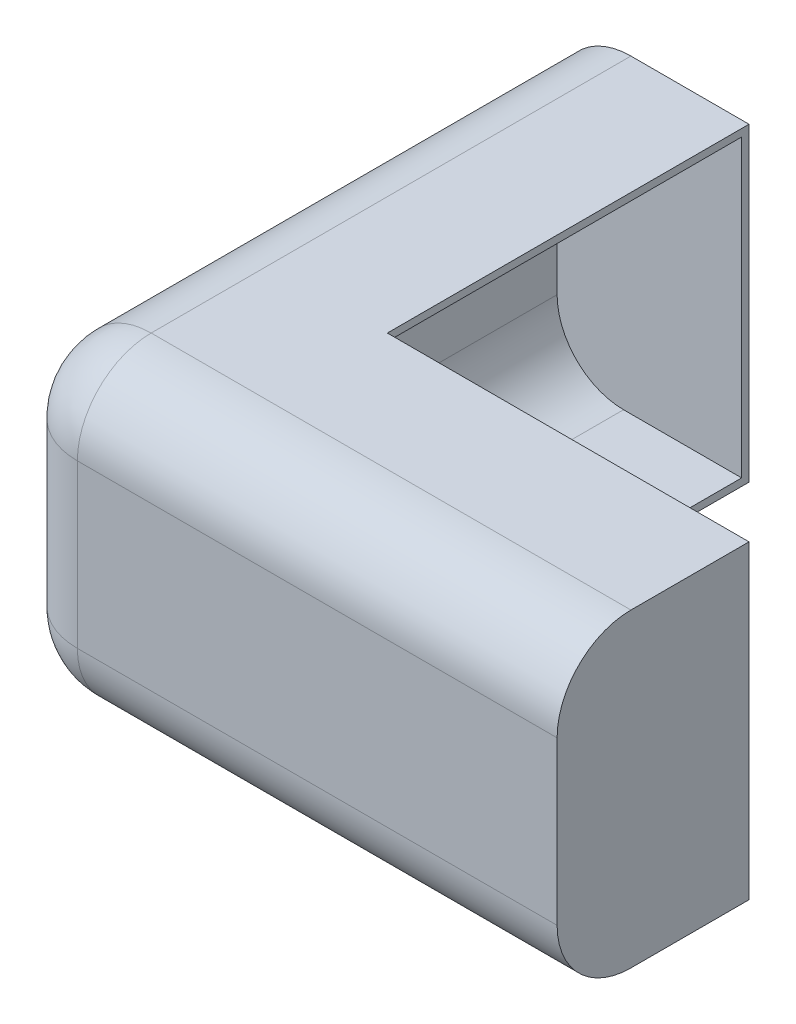
ISO-10303-21;
HEADER;
FILE_DESCRIPTION(('STEP AP214'),'2;1');
FILE_NAME('part.step','',(''),(''),'','','');
FILE_SCHEMA(('AUTOMOTIVE_DESIGN { 1 0 10303 214 1 1 1 1 }'));
ENDSEC;
DATA;
#1=APPLICATION_CONTEXT('core data for automotive mechanical design processes');
#2=APPLICATION_PROTOCOL_DEFINITION('international standard','automotive_design',2000,#1);
#3=PRODUCT_CONTEXT('',#1,'mechanical');
#4=PRODUCT('Part','Part','',(#3));
#5=PRODUCT_RELATED_PRODUCT_CATEGORY('part','',(#4));
#6=PRODUCT_DEFINITION_FORMATION('','',#4);
#7=PRODUCT_DEFINITION_CONTEXT('part definition',#1,'design');
#8=PRODUCT_DEFINITION('design','',#6,#7);
#9=PRODUCT_DEFINITION_SHAPE('','',#8);
#10=(LENGTH_UNIT() NAMED_UNIT(*) SI_UNIT(.MILLI.,.METRE.));
#11=(NAMED_UNIT(*) PLANE_ANGLE_UNIT() SI_UNIT($,.RADIAN.));
#12=(NAMED_UNIT(*) SI_UNIT($,.STERADIAN.) SOLID_ANGLE_UNIT());
#13=UNCERTAINTY_MEASURE_WITH_UNIT(LENGTH_MEASURE(1.E-05),#10,'distance_accuracy_value','');
#14=(GEOMETRIC_REPRESENTATION_CONTEXT(3) GLOBAL_UNCERTAINTY_ASSIGNED_CONTEXT((#13)) GLOBAL_UNIT_ASSIGNED_CONTEXT((#10,
#11,#12)) REPRESENTATION_CONTEXT('',''));
#15=CARTESIAN_POINT('',(0.,0.,0.));
#16=DIRECTION('',(0.,0.,1.));
#17=DIRECTION('',(1.,0.,0.));
#18=AXIS2_PLACEMENT_3D('',#15,#16,#17);
#19=CARTESIAN_POINT('',(0.,133.35,0.));
#20=DIRECTION('',(0.,0.,1.));
#21=DIRECTION('',(1.,0.,0.));
#22=AXIS2_PLACEMENT_3D('',#19,#20,#21);
#23=PLANE('',#22);
#24=DIRECTION('',(-1.,0.,0.));
#25=VECTOR('',#24,1.);
#26=CARTESIAN_POINT('',(0.,3.175,0.));
#27=LINE('',#26,#25);
#28=CARTESIAN_POINT('',(152.4,3.175,0.));
#29=VERTEX_POINT('',#28);
#30=CARTESIAN_POINT('',(0.,3.17500000000001,0.));
#31=VERTEX_POINT('',#30);
#32=EDGE_CURVE('E227',#29,#31,#27,.T.);
#33=ORIENTED_EDGE('',*,*,#32,.F.);
#34=DIRECTION('',(0.,-1.,0.));
#35=VECTOR('',#34,1.);
#36=CARTESIAN_POINT('',(152.4,133.35,0.));
#37=LINE('',#36,#35);
#38=CARTESIAN_POINT('',(152.4,130.175,0.));
#39=VERTEX_POINT('',#38);
#40=EDGE_CURVE('E238',#39,#29,#37,.T.);
#41=ORIENTED_EDGE('',*,*,#40,.F.);
#42=DIRECTION('',(-1.,0.,0.));
#43=VECTOR('',#42,1.);
#44=CARTESIAN_POINT('',(0.,130.175,0.));
#45=LINE('',#44,#43);
#46=CARTESIAN_POINT('',(0.,130.175,0.));
#47=VERTEX_POINT('',#46);
#48=EDGE_CURVE('E249',#39,#47,#45,.T.);
#49=ORIENTED_EDGE('',*,*,#48,.T.);
#50=DIRECTION('',(0.,-1.,0.));
#51=VECTOR('',#50,1.);
#52=CARTESIAN_POINT('',(0.,133.35,0.));
#53=LINE('',#52,#51);
#54=CARTESIAN_POINT('',(0.,133.35,0.));
#55=VERTEX_POINT('',#54);
#56=EDGE_CURVE('E343',#55,#47,#53,.T.);
#57=ORIENTED_EDGE('',*,*,#56,.F.);
#58=DIRECTION('',(-1.,0.,0.));
#59=VECTOR('',#58,1.);
#60=CARTESIAN_POINT('',(0.,133.35,0.));
#61=LINE('',#60,#59);
#62=CARTESIAN_POINT('',(155.575,133.35,0.));
#63=VERTEX_POINT('',#62);
#64=EDGE_CURVE('E299',#63,#55,#61,.T.);
#65=ORIENTED_EDGE('',*,*,#64,.F.);
#66=DIRECTION('',(0.,-1.,0.));
#67=VECTOR('',#66,1.);
#68=CARTESIAN_POINT('',(155.575,133.35,0.));
#69=LINE('',#68,#67);
#70=CARTESIAN_POINT('',(155.575,0.,0.));
#71=VERTEX_POINT('',#70);
#72=EDGE_CURVE('E313',#63,#71,#69,.T.);
#73=ORIENTED_EDGE('',*,*,#72,.T.);
#74=DIRECTION('',(-1.,0.,0.));
#75=VECTOR('',#74,1.);
#76=CARTESIAN_POINT('',(0.,0.,0.));
#77=LINE('',#76,#75);
#78=CARTESIAN_POINT('',(0.,0.,0.));
#79=VERTEX_POINT('',#78);
#80=EDGE_CURVE('E314',#71,#79,#77,.T.);
#81=ORIENTED_EDGE('',*,*,#80,.T.);
#82=EDGE_CURVE('E342',#31,#79,#53,.T.);
#83=ORIENTED_EDGE('',*,*,#82,.F.);
#84=EDGE_LOOP('',(#33,#41,#49,#57,#65,#73,#81,#83));
#85=FACE_BOUND('',#84,.T.);
#86=ADVANCED_FACE('F39',(#85),#23,.F.);
#87=CARTESIAN_POINT('',(0.,133.35,0.));
#88=DIRECTION('',(-1.,0.,0.));
#89=DIRECTION('',(0.,0.,1.));
#90=AXIS2_PLACEMENT_3D('',#87,#88,#89);
#91=PLANE('',#90);
#92=DIRECTION('',(0.,0.,-1.));
#93=VECTOR('',#92,1.);
#94=CARTESIAN_POINT('',(0.,3.175,0.));
#95=LINE('',#94,#93);
#96=CARTESIAN_POINT('',(0.,3.175,-152.4));
#97=VERTEX_POINT('',#96);
#98=EDGE_CURVE('E296',#31,#97,#95,.T.);
#99=ORIENTED_EDGE('',*,*,#98,.F.);
#100=ORIENTED_EDGE('',*,*,#82,.T.);
#101=DIRECTION('',(0.,0.,-1.));
#102=VECTOR('',#101,1.);
#103=CARTESIAN_POINT('',(0.,0.,0.));
#104=LINE('',#103,#102);
#105=CARTESIAN_POINT('',(0.,0.,-155.575));
#106=VERTEX_POINT('',#105);
#107=EDGE_CURVE('E318',#79,#106,#104,.T.);
#108=ORIENTED_EDGE('',*,*,#107,.T.);
#109=DIRECTION('',(0.,-1.,0.));
#110=VECTOR('',#109,1.);
#111=CARTESIAN_POINT('',(0.,133.35,-155.575));
#112=LINE('',#111,#110);
#113=CARTESIAN_POINT('',(0.,133.35,-155.575));
#114=VERTEX_POINT('',#113);
#115=EDGE_CURVE('E338',#114,#106,#112,.T.);
#116=ORIENTED_EDGE('',*,*,#115,.F.);
#117=DIRECTION('',(0.,0.,-1.));
#118=VECTOR('',#117,1.);
#119=CARTESIAN_POINT('',(0.,133.35,0.));
#120=LINE('',#119,#118);
#121=EDGE_CURVE('E303',#55,#114,#120,.T.);
#122=ORIENTED_EDGE('',*,*,#121,.F.);
#123=ORIENTED_EDGE('',*,*,#56,.T.);
#124=DIRECTION('',(0.,0.,-1.));
#125=VECTOR('',#124,1.);
#126=CARTESIAN_POINT('',(0.,130.175,0.));
#127=LINE('',#126,#125);
#128=CARTESIAN_POINT('',(0.,130.175,-152.4));
#129=VERTEX_POINT('',#128);
#130=EDGE_CURVE('E284',#47,#129,#127,.T.);
#131=ORIENTED_EDGE('',*,*,#130,.T.);
#132=DIRECTION('',(0.,-1.,0.));
#133=VECTOR('',#132,1.);
#134=CARTESIAN_POINT('',(0.,133.35,-152.4));
#135=LINE('',#134,#133);
#136=EDGE_CURVE('E202',#129,#97,#135,.T.);
#137=ORIENTED_EDGE('',*,*,#136,.T.);
#138=EDGE_LOOP('',(#99,#100,#108,#116,#122,#123,#131,#137));
#139=FACE_BOUND('',#138,.T.);
#140=ADVANCED_FACE('F438',(#139),#91,.F.);
#141=CARTESIAN_POINT('',(0.,133.35,-155.575));
#142=DIRECTION('',(0.,0.,1.));
#143=DIRECTION('',(1.,0.,0.));
#144=AXIS2_PLACEMENT_3D('',#141,#142,#143);
#145=PLANE('',#144);
#146=DIRECTION('',(-1.,0.,0.));
#147=VECTOR('',#146,1.);
#148=CARTESIAN_POINT('',(0.,0.,-155.575));
#149=LINE('',#148,#147);
#150=CARTESIAN_POINT('',(-50.8,0.,-155.575));
#151=VERTEX_POINT('',#150);
#152=EDGE_CURVE('E321',#106,#151,#149,.T.);
#153=ORIENTED_EDGE('',*,*,#152,.T.);
#154=CARTESIAN_POINT('',(-50.8,31.75,-155.575));
#155=DIRECTION('',(0.,0.,1.));
#156=DIRECTION('',(1.,0.,0.));
#157=AXIS2_PLACEMENT_3D('',#154,#155,#156);
#158=CIRCLE('',#157,31.75);
#159=CARTESIAN_POINT('',(-82.55,31.75,-155.575));
#160=VERTEX_POINT('',#159);
#161=EDGE_CURVE('E375',#151,#160,#158,.F.);
#162=ORIENTED_EDGE('',*,*,#161,.T.);
#163=DIRECTION('',(0.,-1.,0.));
#164=VECTOR('',#163,1.);
#165=CARTESIAN_POINT('',(-82.55,133.35,-155.575));
#166=LINE('',#165,#164);
#167=CARTESIAN_POINT('',(-82.55,101.6,-155.575));
#168=VERTEX_POINT('',#167);
#169=EDGE_CURVE('E334',#168,#160,#166,.T.);
#170=ORIENTED_EDGE('',*,*,#169,.F.);
#171=CARTESIAN_POINT('',(-50.8,101.6,-155.575));
#172=DIRECTION('',(0.,0.,1.));
#173=DIRECTION('',(1.,0.,0.));
#174=AXIS2_PLACEMENT_3D('',#171,#172,#173);
#175=CIRCLE('',#174,31.75);
#176=CARTESIAN_POINT('',(-50.8,133.35,-155.575));
#177=VERTEX_POINT('',#176);
#178=EDGE_CURVE('E372',#168,#177,#175,.F.);
#179=ORIENTED_EDGE('',*,*,#178,.T.);
#180=DIRECTION('',(-1.,0.,0.));
#181=VECTOR('',#180,1.);
#182=CARTESIAN_POINT('',(0.,133.35,-155.575));
#183=LINE('',#182,#181);
#184=EDGE_CURVE('E307',#114,#177,#183,.T.);
#185=ORIENTED_EDGE('',*,*,#184,.F.);
#186=ORIENTED_EDGE('',*,*,#115,.T.);
#187=EDGE_LOOP('',(#153,#162,#170,#179,#185,#186));
#188=FACE_BOUND('',#187,.T.);
#189=ADVANCED_FACE('F442',(#188),#145,.F.);
#190=CARTESIAN_POINT('',(-82.55,133.35,82.55));
#191=DIRECTION('',(1.,0.,0.));
#192=DIRECTION('',(0.,0.,-1.));
#193=AXIS2_PLACEMENT_3D('',#190,#191,#192);
#194=PLANE('',#193);
#195=ORIENTED_EDGE('',*,*,#169,.T.);
#196=DIRECTION('',(0.,0.,1.));
#197=VECTOR('',#196,1.);
#198=CARTESIAN_POINT('',(-82.55,31.75,82.55));
#199=LINE('',#198,#197);
#200=CARTESIAN_POINT('',(-82.55,31.75,50.8));
#201=VERTEX_POINT('',#200);
#202=EDGE_CURVE('E363',#160,#201,#199,.T.);
#203=ORIENTED_EDGE('',*,*,#202,.T.);
#204=DIRECTION('',(0.,-1.,0.));
#205=VECTOR('',#204,1.);
#206=CARTESIAN_POINT('',(-82.55,133.35,50.8));
#207=LINE('',#206,#205);
#208=CARTESIAN_POINT('',(-82.55,101.6,50.8));
#209=VERTEX_POINT('',#208);
#210=EDGE_CURVE('E360',#201,#209,#207,.F.);
#211=ORIENTED_EDGE('',*,*,#210,.T.);
#212=DIRECTION('',(0.,0.,1.));
#213=VECTOR('',#212,1.);
#214=CARTESIAN_POINT('',(-82.55,101.6,82.55));
#215=LINE('',#214,#213);
#216=EDGE_CURVE('E357',#209,#168,#215,.F.);
#217=ORIENTED_EDGE('',*,*,#216,.T.);
#218=EDGE_LOOP('',(#195,#203,#211,#217));
#219=FACE_BOUND('',#218,.T.);
#220=ADVANCED_FACE('F446',(#219),#194,.F.);
#221=CARTESIAN_POINT('',(-82.55,133.35,82.55));
#222=DIRECTION('',(0.,0.,-1.));
#223=DIRECTION('',(-1.,0.,0.));
#224=AXIS2_PLACEMENT_3D('',#221,#222,#223);
#225=PLANE('',#224);
#226=DIRECTION('',(0.,-1.,0.));
#227=VECTOR('',#226,1.);
#228=CARTESIAN_POINT('',(-50.8,133.35,82.55));
#229=LINE('',#228,#227);
#230=CARTESIAN_POINT('',(-50.8,101.6,82.55));
#231=VERTEX_POINT('',#230);
#232=CARTESIAN_POINT('',(-50.8,31.75,82.55));
#233=VERTEX_POINT('',#232);
#234=EDGE_CURVE('E350',#231,#233,#229,.T.);
#235=ORIENTED_EDGE('',*,*,#234,.T.);
#236=DIRECTION('',(1.,0.,0.));
#237=VECTOR('',#236,1.);
#238=CARTESIAN_POINT('',(155.575,31.75,82.55));
#239=LINE('',#238,#237);
#240=CARTESIAN_POINT('',(155.575,31.75,82.55));
#241=VERTEX_POINT('',#240);
#242=EDGE_CURVE('E354',#233,#241,#239,.T.);
#243=ORIENTED_EDGE('',*,*,#242,.T.);
#244=DIRECTION('',(0.,-1.,0.));
#245=VECTOR('',#244,1.);
#246=CARTESIAN_POINT('',(155.575,133.35,82.55));
#247=LINE('',#246,#245);
#248=CARTESIAN_POINT('',(155.575,101.6,82.55));
#249=VERTEX_POINT('',#248);
#250=EDGE_CURVE('E330',#249,#241,#247,.T.);
#251=ORIENTED_EDGE('',*,*,#250,.F.);
#252=DIRECTION('',(1.,0.,0.));
#253=VECTOR('',#252,1.);
#254=CARTESIAN_POINT('',(-82.55,101.6,82.55));
#255=LINE('',#254,#253);
#256=EDGE_CURVE('E347',#249,#231,#255,.F.);
#257=ORIENTED_EDGE('',*,*,#256,.T.);
#258=EDGE_LOOP('',(#235,#243,#251,#257));
#259=FACE_BOUND('',#258,.T.);
#260=ADVANCED_FACE('F416',(#259),#225,.F.);
#261=CARTESIAN_POINT('',(155.575,133.35,0.));
#262=DIRECTION('',(-1.,0.,0.));
#263=DIRECTION('',(0.,0.,1.));
#264=AXIS2_PLACEMENT_3D('',#261,#262,#263);
#265=PLANE('',#264);
#266=ORIENTED_EDGE('',*,*,#250,.T.);
#267=CARTESIAN_POINT('',(155.575,31.75,50.8));
#268=DIRECTION('',(-1.,0.,0.));
#269=DIRECTION('',(0.,0.,1.));
#270=AXIS2_PLACEMENT_3D('',#267,#268,#269);
#271=CIRCLE('',#270,31.75);
#272=CARTESIAN_POINT('',(155.575,0.,50.8));
#273=VERTEX_POINT('',#272);
#274=EDGE_CURVE('E11',#241,#273,#271,.F.);
#275=ORIENTED_EDGE('',*,*,#274,.T.);
#276=DIRECTION('',(0.,0.,-1.));
#277=VECTOR('',#276,1.);
#278=CARTESIAN_POINT('',(155.575,0.,0.));
#279=LINE('',#278,#277);
#280=EDGE_CURVE('E304',#273,#71,#279,.T.);
#281=ORIENTED_EDGE('',*,*,#280,.T.);
#282=ORIENTED_EDGE('',*,*,#72,.F.);
#283=DIRECTION('',(0.,0.,-1.));
#284=VECTOR('',#283,1.);
#285=CARTESIAN_POINT('',(155.575,133.35,0.));
#286=LINE('',#285,#284);
#287=CARTESIAN_POINT('',(155.575,133.35,50.8));
#288=VERTEX_POINT('',#287);
#289=EDGE_CURVE('E310',#288,#63,#286,.T.);
#290=ORIENTED_EDGE('',*,*,#289,.F.);
#291=CARTESIAN_POINT('',(155.575,101.6,50.8));
#292=DIRECTION('',(-1.,0.,0.));
#293=DIRECTION('',(0.,0.,1.));
#294=AXIS2_PLACEMENT_3D('',#291,#292,#293);
#295=CIRCLE('',#294,31.75);
#296=EDGE_CURVE('E49',#288,#249,#295,.F.);
#297=ORIENTED_EDGE('',*,*,#296,.T.);
#298=EDGE_LOOP('',(#266,#275,#281,#282,#290,#297));
#299=FACE_BOUND('',#298,.T.);
#300=ADVANCED_FACE('F427',(#299),#265,.F.);
#301=CARTESIAN_POINT('',(0.,133.35,0.));
#302=DIRECTION('',(0.,-1.,0.));
#303=DIRECTION('',(0.,0.,-1.));
#304=AXIS2_PLACEMENT_3D('',#301,#302,#303);
#305=PLANE('',#304);
#306=ORIENTED_EDGE('',*,*,#184,.T.);
#307=DIRECTION('',(0.,0.,1.));
#308=VECTOR('',#307,1.);
#309=CARTESIAN_POINT('',(-50.8,133.35,0.));
#310=LINE('',#309,#308);
#311=CARTESIAN_POINT('',(-50.8,133.35,50.8));
#312=VERTEX_POINT('',#311);
#313=EDGE_CURVE('E65',#177,#312,#310,.T.);
#314=ORIENTED_EDGE('',*,*,#313,.T.);
#315=DIRECTION('',(1.,0.,0.));
#316=VECTOR('',#315,1.);
#317=CARTESIAN_POINT('',(0.,133.35,50.8));
#318=LINE('',#317,#316);
#319=EDGE_CURVE('E378',#312,#288,#318,.T.);
#320=ORIENTED_EDGE('',*,*,#319,.T.);
#321=ORIENTED_EDGE('',*,*,#289,.T.);
#322=ORIENTED_EDGE('',*,*,#64,.T.);
#323=ORIENTED_EDGE('',*,*,#121,.T.);
#324=EDGE_LOOP('',(#306,#314,#320,#321,#322,#323));
#325=FACE_BOUND('',#324,.T.);
#326=ADVANCED_FACE('F424',(#325),#305,.F.);
#327=CARTESIAN_POINT('',(0.,0.,0.));
#328=DIRECTION('',(0.,-1.,0.));
#329=DIRECTION('',(0.,0.,-1.));
#330=AXIS2_PLACEMENT_3D('',#327,#328,#329);
#331=PLANE('',#330);
#332=DIRECTION('',(1.,0.,0.));
#333=VECTOR('',#332,1.);
#334=CARTESIAN_POINT('',(-82.55,0.,50.8));
#335=LINE('',#334,#333);
#336=CARTESIAN_POINT('',(-50.8,0.,50.8));
#337=VERTEX_POINT('',#336);
#338=EDGE_CURVE('E366',#273,#337,#335,.F.);
#339=ORIENTED_EDGE('',*,*,#338,.T.);
#340=DIRECTION('',(0.,0.,1.));
#341=VECTOR('',#340,1.);
#342=CARTESIAN_POINT('',(-50.8,0.,-155.575));
#343=LINE('',#342,#341);
#344=EDGE_CURVE('E369',#337,#151,#343,.F.);
#345=ORIENTED_EDGE('',*,*,#344,.T.);
#346=ORIENTED_EDGE('',*,*,#152,.F.);
#347=ORIENTED_EDGE('',*,*,#107,.F.);
#348=ORIENTED_EDGE('',*,*,#80,.F.);
#349=ORIENTED_EDGE('',*,*,#280,.F.);
#350=EDGE_LOOP('',(#339,#345,#346,#347,#348,#349));
#351=FACE_BOUND('',#350,.T.);
#352=ADVANCED_FACE('F461',(#351),#331,.T.);
#353=CARTESIAN_POINT('',(-50.8,101.6,0.));
#354=DIRECTION('',(0.,0.,1.));
#355=DIRECTION('',(1.,0.,0.));
#356=AXIS2_PLACEMENT_3D('',#353,#354,#355);
#357=CYLINDRICAL_SURFACE('',#356,31.75);
#358=ORIENTED_EDGE('',*,*,#178,.F.);
#359=ORIENTED_EDGE('',*,*,#216,.F.);
#360=CARTESIAN_POINT('',(-50.8,101.6,50.8));
#361=DIRECTION('',(0.,0.,1.));
#362=DIRECTION('',(1.,0.,0.));
#363=AXIS2_PLACEMENT_3D('',#360,#361,#362);
#364=CIRCLE('',#363,31.75);
#365=EDGE_CURVE('E43',#312,#209,#364,.T.);
#366=ORIENTED_EDGE('',*,*,#365,.F.);
#367=ORIENTED_EDGE('',*,*,#313,.F.);
#368=EDGE_LOOP('',(#358,#359,#366,#367));
#369=FACE_BOUND('',#368,.T.);
#370=ADVANCED_FACE('F41',(#369),#357,.T.);
#371=CARTESIAN_POINT('',(0.,101.6,50.8));
#372=DIRECTION('',(1.,0.,0.));
#373=DIRECTION('',(0.,0.,-1.));
#374=AXIS2_PLACEMENT_3D('',#371,#372,#373);
#375=CYLINDRICAL_SURFACE('',#374,31.75);
#376=ORIENTED_EDGE('',*,*,#296,.F.);
#377=ORIENTED_EDGE('',*,*,#319,.F.);
#378=CARTESIAN_POINT('',(-50.8,101.6,50.8));
#379=DIRECTION('',(-1.,0.,0.));
#380=DIRECTION('',(0.,0.,1.));
#381=AXIS2_PLACEMENT_3D('',#378,#379,#380);
#382=CIRCLE('',#381,31.75);
#383=EDGE_CURVE('E398',#231,#312,#382,.T.);
#384=ORIENTED_EDGE('',*,*,#383,.F.);
#385=ORIENTED_EDGE('',*,*,#256,.F.);
#386=EDGE_LOOP('',(#376,#377,#384,#385));
#387=FACE_BOUND('',#386,.T.);
#388=ADVANCED_FACE('F422',(#387),#375,.T.);
#389=CARTESIAN_POINT('',(-82.55,31.75,50.8));
#390=DIRECTION('',(-1.,0.,0.));
#391=DIRECTION('',(0.,0.,1.));
#392=AXIS2_PLACEMENT_3D('',#389,#390,#391);
#393=CYLINDRICAL_SURFACE('',#392,31.75);
#394=ORIENTED_EDGE('',*,*,#274,.F.);
#395=ORIENTED_EDGE('',*,*,#242,.F.);
#396=CARTESIAN_POINT('',(-50.8,31.75,50.8));
#397=DIRECTION('',(-1.,0.,0.));
#398=DIRECTION('',(0.,0.,1.));
#399=AXIS2_PLACEMENT_3D('',#396,#397,#398);
#400=CIRCLE('',#399,31.75);
#401=EDGE_CURVE('E395',#337,#233,#400,.T.);
#402=ORIENTED_EDGE('',*,*,#401,.F.);
#403=ORIENTED_EDGE('',*,*,#338,.F.);
#404=EDGE_LOOP('',(#394,#395,#402,#403));
#405=FACE_BOUND('',#404,.T.);
#406=ADVANCED_FACE('F459',(#405),#393,.T.);
#407=CARTESIAN_POINT('',(-50.8,31.75,82.55));
#408=DIRECTION('',(0.,0.,-1.));
#409=DIRECTION('',(-1.,0.,0.));
#410=AXIS2_PLACEMENT_3D('',#407,#408,#409);
#411=CYLINDRICAL_SURFACE('',#410,31.75);
#412=ORIENTED_EDGE('',*,*,#161,.F.);
#413=ORIENTED_EDGE('',*,*,#344,.F.);
#414=CARTESIAN_POINT('',(-50.8,31.75,50.8));
#415=DIRECTION('',(0.,0.,1.));
#416=DIRECTION('',(1.,0.,0.));
#417=AXIS2_PLACEMENT_3D('',#414,#415,#416);
#418=CIRCLE('',#417,31.75);
#419=EDGE_CURVE('E391',#201,#337,#418,.T.);
#420=ORIENTED_EDGE('',*,*,#419,.F.);
#421=ORIENTED_EDGE('',*,*,#202,.F.);
#422=EDGE_LOOP('',(#412,#413,#420,#421));
#423=FACE_BOUND('',#422,.T.);
#424=ADVANCED_FACE('F452',(#423),#411,.T.);
#425=CARTESIAN_POINT('',(-50.8,101.6,50.8));
#426=DIRECTION('',(0.,0.,1.));
#427=DIRECTION('',(1.,0.,0.));
#428=AXIS2_PLACEMENT_3D('',#425,#426,#427);
#429=SPHERICAL_SURFACE('',#428,31.75);
#430=ORIENTED_EDGE('',*,*,#383,.T.);
#431=ORIENTED_EDGE('',*,*,#365,.T.);
#432=CARTESIAN_POINT('',(-50.8,101.6,50.8));
#433=DIRECTION('',(0.,1.,0.));
#434=DIRECTION('',(0.,0.,1.));
#435=AXIS2_PLACEMENT_3D('',#432,#433,#434);
#436=CIRCLE('',#435,31.75);
#437=EDGE_CURVE('E387',#231,#209,#436,.F.);
#438=ORIENTED_EDGE('',*,*,#437,.F.);
#439=EDGE_LOOP('',(#430,#431,#438));
#440=FACE_BOUND('',#439,.T.);
#441=ADVANCED_FACE('F407',(#440),#429,.T.);
#442=CARTESIAN_POINT('',(-50.8,31.75,50.8));
#443=DIRECTION('',(0.,0.,1.));
#444=DIRECTION('',(1.,0.,0.));
#445=AXIS2_PLACEMENT_3D('',#442,#443,#444);
#446=SPHERICAL_SURFACE('',#445,31.75);
#447=ORIENTED_EDGE('',*,*,#419,.T.);
#448=ORIENTED_EDGE('',*,*,#401,.T.);
#449=CARTESIAN_POINT('',(-50.8,31.75,50.8));
#450=DIRECTION('',(0.,-1.,0.));
#451=DIRECTION('',(0.,0.,-1.));
#452=AXIS2_PLACEMENT_3D('',#449,#450,#451);
#453=CIRCLE('',#452,31.75);
#454=EDGE_CURVE('E245',#201,#233,#453,.F.);
#455=ORIENTED_EDGE('',*,*,#454,.F.);
#456=EDGE_LOOP('',(#447,#448,#455));
#457=FACE_BOUND('',#456,.T.);
#458=ADVANCED_FACE('F455',(#457),#446,.T.);
#459=CARTESIAN_POINT('',(-50.8,133.35,50.8));
#460=DIRECTION('',(0.,-1.,0.));
#461=DIRECTION('',(0.,0.,-1.));
#462=AXIS2_PLACEMENT_3D('',#459,#460,#461);
#463=CYLINDRICAL_SURFACE('',#462,31.75);
#464=ORIENTED_EDGE('',*,*,#437,.T.);
#465=ORIENTED_EDGE('',*,*,#210,.F.);
#466=ORIENTED_EDGE('',*,*,#454,.T.);
#467=ORIENTED_EDGE('',*,*,#234,.F.);
#468=EDGE_LOOP('',(#464,#465,#466,#467));
#469=FACE_BOUND('',#468,.T.);
#470=ADVANCED_FACE('F413',(#469),#463,.T.);
#471=CARTESIAN_POINT('',(0.,133.35,-152.4));
#472=DIRECTION('',(0.,0.,1.));
#473=DIRECTION('',(1.,0.,0.));
#474=AXIS2_PLACEMENT_3D('',#471,#472,#473);
#475=PLANE('',#474);
#476=DIRECTION('',(-1.,0.,0.));
#477=VECTOR('',#476,1.);
#478=CARTESIAN_POINT('',(0.,3.175,-152.4));
#479=LINE('',#478,#477);
#480=CARTESIAN_POINT('',(-50.8,3.175,-152.4));
#481=VERTEX_POINT('',#480);
#482=EDGE_CURVE('E250',#97,#481,#479,.T.);
#483=ORIENTED_EDGE('',*,*,#482,.F.);
#484=ORIENTED_EDGE('',*,*,#136,.F.);
#485=DIRECTION('',(-1.,0.,0.));
#486=VECTOR('',#485,1.);
#487=CARTESIAN_POINT('',(0.,130.175,-152.4));
#488=LINE('',#487,#486);
#489=CARTESIAN_POINT('',(-50.8,130.175,-152.4));
#490=VERTEX_POINT('',#489);
#491=EDGE_CURVE('E57',#129,#490,#488,.T.);
#492=ORIENTED_EDGE('',*,*,#491,.T.);
#493=CARTESIAN_POINT('',(-50.8,101.6,-152.4));
#494=DIRECTION('',(0.,0.,1.));
#495=DIRECTION('',(1.,0.,0.));
#496=AXIS2_PLACEMENT_3D('',#493,#494,#495);
#497=CIRCLE('',#496,28.575);
#498=CARTESIAN_POINT('',(-79.375,101.6,-152.4));
#499=VERTEX_POINT('',#498);
#500=EDGE_CURVE('E193',#499,#490,#497,.F.);
#501=ORIENTED_EDGE('',*,*,#500,.F.);
#502=DIRECTION('',(0.,-1.,0.));
#503=VECTOR('',#502,1.);
#504=CARTESIAN_POINT('',(-79.375,133.35,-152.4));
#505=LINE('',#504,#503);
#506=CARTESIAN_POINT('',(-79.375,31.75,-152.4));
#507=VERTEX_POINT('',#506);
#508=EDGE_CURVE('E197',#499,#507,#505,.T.);
#509=ORIENTED_EDGE('',*,*,#508,.T.);
#510=CARTESIAN_POINT('',(-50.8,31.75,-152.4));
#511=DIRECTION('',(0.,0.,1.));
#512=DIRECTION('',(1.,0.,0.));
#513=AXIS2_PLACEMENT_3D('',#510,#511,#512);
#514=CIRCLE('',#513,28.575);
#515=EDGE_CURVE('E179',#481,#507,#514,.F.);
#516=ORIENTED_EDGE('',*,*,#515,.F.);
#517=EDGE_LOOP('',(#483,#484,#492,#501,#509,#516));
#518=FACE_BOUND('',#517,.T.);
#519=ADVANCED_FACE('F198',(#518),#475,.T.);
#520=CARTESIAN_POINT('',(-79.375,133.35,82.55));
#521=DIRECTION('',(1.,0.,0.));
#522=DIRECTION('',(0.,0.,-1.));
#523=AXIS2_PLACEMENT_3D('',#520,#521,#522);
#524=PLANE('',#523);
#525=ORIENTED_EDGE('',*,*,#508,.F.);
#526=DIRECTION('',(0.,0.,-1.));
#527=VECTOR('',#526,1.);
#528=CARTESIAN_POINT('',(-79.375,101.6,82.55));
#529=LINE('',#528,#527);
#530=CARTESIAN_POINT('',(-79.375,101.6,50.8));
#531=VERTEX_POINT('',#530);
#532=EDGE_CURVE('E215',#531,#499,#529,.T.);
#533=ORIENTED_EDGE('',*,*,#532,.F.);
#534=DIRECTION('',(0.,1.,0.));
#535=VECTOR('',#534,1.);
#536=CARTESIAN_POINT('',(-79.375,133.35,50.8));
#537=LINE('',#536,#535);
#538=CARTESIAN_POINT('',(-79.375,31.75,50.8));
#539=VERTEX_POINT('',#538);
#540=EDGE_CURVE('E207',#539,#531,#537,.T.);
#541=ORIENTED_EDGE('',*,*,#540,.F.);
#542=DIRECTION('',(0.,0.,-1.));
#543=VECTOR('',#542,1.);
#544=CARTESIAN_POINT('',(-79.375,31.75,82.55));
#545=LINE('',#544,#543);
#546=EDGE_CURVE('E184',#507,#539,#545,.F.);
#547=ORIENTED_EDGE('',*,*,#546,.F.);
#548=EDGE_LOOP('',(#525,#533,#541,#547));
#549=FACE_BOUND('',#548,.T.);
#550=ADVANCED_FACE('F206',(#549),#524,.T.);
#551=CARTESIAN_POINT('',(-82.55,133.35,79.375));
#552=DIRECTION('',(0.,0.,-1.));
#553=DIRECTION('',(-1.,0.,0.));
#554=AXIS2_PLACEMENT_3D('',#551,#552,#553);
#555=PLANE('',#554);
#556=DIRECTION('',(0.,1.,0.));
#557=VECTOR('',#556,1.);
#558=CARTESIAN_POINT('',(-50.8,133.35,79.375));
#559=LINE('',#558,#557);
#560=CARTESIAN_POINT('',(-50.8,101.6,79.375));
#561=VERTEX_POINT('',#560);
#562=CARTESIAN_POINT('',(-50.8,31.75,79.375));
#563=VERTEX_POINT('',#562);
#564=EDGE_CURVE('E253',#561,#563,#559,.F.);
#565=ORIENTED_EDGE('',*,*,#564,.F.);
#566=DIRECTION('',(-1.,0.,0.));
#567=VECTOR('',#566,1.);
#568=CARTESIAN_POINT('',(-82.55,101.6,79.375));
#569=LINE('',#568,#567);
#570=CARTESIAN_POINT('',(152.4,101.6,79.375));
#571=VERTEX_POINT('',#570);
#572=EDGE_CURVE('E257',#571,#561,#569,.T.);
#573=ORIENTED_EDGE('',*,*,#572,.F.);
#574=DIRECTION('',(0.,-1.,0.));
#575=VECTOR('',#574,1.);
#576=CARTESIAN_POINT('',(152.4,133.35,79.375));
#577=LINE('',#576,#575);
#578=CARTESIAN_POINT('',(152.4,31.75,79.375));
#579=VERTEX_POINT('',#578);
#580=EDGE_CURVE('E203',#571,#579,#577,.T.);
#581=ORIENTED_EDGE('',*,*,#580,.T.);
#582=DIRECTION('',(-1.,0.,0.));
#583=VECTOR('',#582,1.);
#584=CARTESIAN_POINT('',(-82.55,31.75,79.375));
#585=LINE('',#584,#583);
#586=EDGE_CURVE('E222',#563,#579,#585,.F.);
#587=ORIENTED_EDGE('',*,*,#586,.F.);
#588=EDGE_LOOP('',(#565,#573,#581,#587));
#589=FACE_BOUND('',#588,.T.);
#590=ADVANCED_FACE('F490',(#589),#555,.T.);
#591=CARTESIAN_POINT('',(152.4,133.35,0.));
#592=DIRECTION('',(-1.,0.,0.));
#593=DIRECTION('',(0.,0.,1.));
#594=AXIS2_PLACEMENT_3D('',#591,#592,#593);
#595=PLANE('',#594);
#596=ORIENTED_EDGE('',*,*,#580,.F.);
#597=CARTESIAN_POINT('',(152.4,101.6,50.8));
#598=DIRECTION('',(-1.,0.,0.));
#599=DIRECTION('',(0.,0.,1.));
#600=AXIS2_PLACEMENT_3D('',#597,#598,#599);
#601=CIRCLE('',#600,28.575);
#602=CARTESIAN_POINT('',(152.4,130.175,50.8));
#603=VERTEX_POINT('',#602);
#604=EDGE_CURVE('E232',#603,#571,#601,.F.);
#605=ORIENTED_EDGE('',*,*,#604,.F.);
#606=DIRECTION('',(0.,0.,-1.));
#607=VECTOR('',#606,1.);
#608=CARTESIAN_POINT('',(152.4,130.175,0.));
#609=LINE('',#608,#607);
#610=EDGE_CURVE('E235',#603,#39,#609,.T.);
#611=ORIENTED_EDGE('',*,*,#610,.T.);
#612=ORIENTED_EDGE('',*,*,#40,.T.);
#613=DIRECTION('',(0.,0.,-1.));
#614=VECTOR('',#613,1.);
#615=CARTESIAN_POINT('',(152.4,3.175,0.));
#616=LINE('',#615,#614);
#617=CARTESIAN_POINT('',(152.4,3.175,50.8));
#618=VERTEX_POINT('',#617);
#619=EDGE_CURVE('E246',#618,#29,#616,.T.);
#620=ORIENTED_EDGE('',*,*,#619,.F.);
#621=CARTESIAN_POINT('',(152.4,31.75,50.8));
#622=DIRECTION('',(-1.,0.,0.));
#623=DIRECTION('',(0.,0.,1.));
#624=AXIS2_PLACEMENT_3D('',#621,#622,#623);
#625=CIRCLE('',#624,28.575);
#626=EDGE_CURVE('E242',#579,#618,#625,.F.);
#627=ORIENTED_EDGE('',*,*,#626,.F.);
#628=EDGE_LOOP('',(#596,#605,#611,#612,#620,#627));
#629=FACE_BOUND('',#628,.T.);
#630=ADVANCED_FACE('F502',(#629),#595,.T.);
#631=CARTESIAN_POINT('',(0.,130.175,0.));
#632=DIRECTION('',(0.,-1.,0.));
#633=DIRECTION('',(0.,0.,-1.));
#634=AXIS2_PLACEMENT_3D('',#631,#632,#633);
#635=PLANE('',#634);
#636=ORIENTED_EDGE('',*,*,#491,.F.);
#637=ORIENTED_EDGE('',*,*,#130,.F.);
#638=ORIENTED_EDGE('',*,*,#48,.F.);
#639=ORIENTED_EDGE('',*,*,#610,.F.);
#640=DIRECTION('',(1.,0.,0.));
#641=VECTOR('',#640,1.);
#642=CARTESIAN_POINT('',(0.,130.175,50.8));
#643=LINE('',#642,#641);
#644=CARTESIAN_POINT('',(-50.8,130.175,50.8));
#645=VERTEX_POINT('',#644);
#646=EDGE_CURVE('E192',#645,#603,#643,.T.);
#647=ORIENTED_EDGE('',*,*,#646,.F.);
#648=DIRECTION('',(0.,0.,-1.));
#649=VECTOR('',#648,1.);
#650=CARTESIAN_POINT('',(-50.8,130.175,0.));
#651=LINE('',#650,#649);
#652=EDGE_CURVE('E229',#490,#645,#651,.F.);
#653=ORIENTED_EDGE('',*,*,#652,.F.);
#654=EDGE_LOOP('',(#636,#637,#638,#639,#647,#653));
#655=FACE_BOUND('',#654,.T.);
#656=ADVANCED_FACE('F475',(#655),#635,.T.);
#657=CARTESIAN_POINT('',(0.,3.175,0.));
#658=DIRECTION('',(0.,-1.,0.));
#659=DIRECTION('',(0.,0.,-1.));
#660=AXIS2_PLACEMENT_3D('',#657,#658,#659);
#661=PLANE('',#660);
#662=DIRECTION('',(1.,0.,0.));
#663=VECTOR('',#662,1.);
#664=CARTESIAN_POINT('',(0.,3.175,50.8));
#665=LINE('',#664,#663);
#666=CARTESIAN_POINT('',(-50.8,3.175,50.8));
#667=VERTEX_POINT('',#666);
#668=EDGE_CURVE('E210',#618,#667,#665,.F.);
#669=ORIENTED_EDGE('',*,*,#668,.F.);
#670=ORIENTED_EDGE('',*,*,#619,.T.);
#671=ORIENTED_EDGE('',*,*,#32,.T.);
#672=ORIENTED_EDGE('',*,*,#98,.T.);
#673=ORIENTED_EDGE('',*,*,#482,.T.);
#674=DIRECTION('',(0.,0.,-1.));
#675=VECTOR('',#674,1.);
#676=CARTESIAN_POINT('',(-50.8,3.175,0.));
#677=LINE('',#676,#675);
#678=EDGE_CURVE('E187',#667,#481,#677,.T.);
#679=ORIENTED_EDGE('',*,*,#678,.F.);
#680=EDGE_LOOP('',(#669,#670,#671,#672,#673,#679));
#681=FACE_BOUND('',#680,.T.);
#682=ADVANCED_FACE('F467',(#681),#661,.F.);
#683=CARTESIAN_POINT('',(-50.8,101.6,0.));
#684=DIRECTION('',(0.,0.,1.));
#685=DIRECTION('',(1.,0.,0.));
#686=AXIS2_PLACEMENT_3D('',#683,#684,#685);
#687=CYLINDRICAL_SURFACE('',#686,28.575);
#688=ORIENTED_EDGE('',*,*,#500,.T.);
#689=ORIENTED_EDGE('',*,*,#652,.T.);
#690=CARTESIAN_POINT('',(-50.8,101.6,50.8));
#691=DIRECTION('',(0.,0.,1.));
#692=DIRECTION('',(1.,0.,0.));
#693=AXIS2_PLACEMENT_3D('',#690,#691,#692);
#694=CIRCLE('',#693,28.575);
#695=EDGE_CURVE('E223',#645,#531,#694,.T.);
#696=ORIENTED_EDGE('',*,*,#695,.T.);
#697=ORIENTED_EDGE('',*,*,#532,.T.);
#698=EDGE_LOOP('',(#688,#689,#696,#697));
#699=FACE_BOUND('',#698,.T.);
#700=ADVANCED_FACE('F472',(#699),#687,.F.);
#701=CARTESIAN_POINT('',(0.,101.6,50.8));
#702=DIRECTION('',(1.,0.,0.));
#703=DIRECTION('',(0.,0.,-1.));
#704=AXIS2_PLACEMENT_3D('',#701,#702,#703);
#705=CYLINDRICAL_SURFACE('',#704,28.575);
#706=ORIENTED_EDGE('',*,*,#604,.T.);
#707=ORIENTED_EDGE('',*,*,#572,.T.);
#708=CARTESIAN_POINT('',(-50.8,101.6,50.8));
#709=DIRECTION('',(1.,0.,0.));
#710=DIRECTION('',(0.,1.,0.));
#711=AXIS2_PLACEMENT_3D('',#708,#709,#710);
#712=CIRCLE('',#711,28.575);
#713=EDGE_CURVE('E228',#561,#645,#712,.F.);
#714=ORIENTED_EDGE('',*,*,#713,.T.);
#715=ORIENTED_EDGE('',*,*,#646,.T.);
#716=EDGE_LOOP('',(#706,#707,#714,#715));
#717=FACE_BOUND('',#716,.T.);
#718=ADVANCED_FACE('F485',(#717),#705,.F.);
#719=CARTESIAN_POINT('',(-82.55,31.75,50.8));
#720=DIRECTION('',(-1.,0.,0.));
#721=DIRECTION('',(0.,0.,1.));
#722=AXIS2_PLACEMENT_3D('',#719,#720,#721);
#723=CYLINDRICAL_SURFACE('',#722,28.575);
#724=ORIENTED_EDGE('',*,*,#626,.T.);
#725=ORIENTED_EDGE('',*,*,#668,.T.);
#726=CARTESIAN_POINT('',(-50.8,31.75,50.8));
#727=DIRECTION('',(-1.,0.,0.));
#728=DIRECTION('',(0.,-1.,0.));
#729=AXIS2_PLACEMENT_3D('',#726,#727,#728);
#730=CIRCLE('',#729,28.575);
#731=EDGE_CURVE('E265',#667,#563,#730,.T.);
#732=ORIENTED_EDGE('',*,*,#731,.T.);
#733=ORIENTED_EDGE('',*,*,#586,.T.);
#734=EDGE_LOOP('',(#724,#725,#732,#733));
#735=FACE_BOUND('',#734,.T.);
#736=ADVANCED_FACE('F499',(#735),#723,.F.);
#737=CARTESIAN_POINT('',(-50.8,31.75,82.55));
#738=DIRECTION('',(0.,0.,-1.));
#739=DIRECTION('',(-1.,0.,0.));
#740=AXIS2_PLACEMENT_3D('',#737,#738,#739);
#741=CYLINDRICAL_SURFACE('',#740,28.575);
#742=ORIENTED_EDGE('',*,*,#515,.T.);
#743=ORIENTED_EDGE('',*,*,#546,.T.);
#744=CARTESIAN_POINT('',(-50.8,31.75,50.8));
#745=DIRECTION('',(0.,0.,1.));
#746=DIRECTION('',(1.,0.,0.));
#747=AXIS2_PLACEMENT_3D('',#744,#745,#746);
#748=CIRCLE('',#747,28.575);
#749=EDGE_CURVE('E270',#539,#667,#748,.T.);
#750=ORIENTED_EDGE('',*,*,#749,.T.);
#751=ORIENTED_EDGE('',*,*,#678,.T.);
#752=EDGE_LOOP('',(#742,#743,#750,#751));
#753=FACE_BOUND('',#752,.T.);
#754=ADVANCED_FACE('F181',(#753),#741,.F.);
#755=CARTESIAN_POINT('',(-50.8,101.6,50.8));
#756=DIRECTION('',(0.,0.,1.));
#757=DIRECTION('',(1.,0.,0.));
#758=AXIS2_PLACEMENT_3D('',#755,#756,#757);
#759=SPHERICAL_SURFACE('',#758,28.575);
#760=ORIENTED_EDGE('',*,*,#713,.F.);
#761=CARTESIAN_POINT('',(-50.8,101.6,50.8));
#762=DIRECTION('',(0.,-1.,0.));
#763=DIRECTION('',(0.,0.,-1.));
#764=AXIS2_PLACEMENT_3D('',#761,#762,#763);
#765=CIRCLE('',#764,28.575);
#766=EDGE_CURVE('E266',#561,#531,#765,.T.);
#767=ORIENTED_EDGE('',*,*,#766,.T.);
#768=ORIENTED_EDGE('',*,*,#695,.F.);
#769=EDGE_LOOP('',(#760,#767,#768));
#770=FACE_BOUND('',#769,.T.);
#771=ADVANCED_FACE('F483',(#770),#759,.F.);
#772=CARTESIAN_POINT('',(-50.8,31.75,50.8));
#773=DIRECTION('',(0.,0.,1.));
#774=DIRECTION('',(1.,0.,0.));
#775=AXIS2_PLACEMENT_3D('',#772,#773,#774);
#776=SPHERICAL_SURFACE('',#775,28.575);
#777=ORIENTED_EDGE('',*,*,#749,.F.);
#778=CARTESIAN_POINT('',(-50.8,31.75,50.8));
#779=DIRECTION('',(0.,-1.,0.));
#780=DIRECTION('',(0.,0.,-1.));
#781=AXIS2_PLACEMENT_3D('',#778,#779,#780);
#782=CIRCLE('',#781,28.575);
#783=EDGE_CURVE('E271',#539,#563,#782,.F.);
#784=ORIENTED_EDGE('',*,*,#783,.T.);
#785=ORIENTED_EDGE('',*,*,#731,.F.);
#786=EDGE_LOOP('',(#777,#784,#785));
#787=FACE_BOUND('',#786,.T.);
#788=ADVANCED_FACE('F497',(#787),#776,.F.);
#789=CARTESIAN_POINT('',(-50.8,133.35,50.8));
#790=DIRECTION('',(0.,-1.,0.));
#791=DIRECTION('',(0.,0.,-1.));
#792=AXIS2_PLACEMENT_3D('',#789,#790,#791);
#793=CYLINDRICAL_SURFACE('',#792,28.575);
#794=ORIENTED_EDGE('',*,*,#766,.F.);
#795=ORIENTED_EDGE('',*,*,#564,.T.);
#796=ORIENTED_EDGE('',*,*,#783,.F.);
#797=ORIENTED_EDGE('',*,*,#540,.T.);
#798=EDGE_LOOP('',(#794,#795,#796,#797));
#799=FACE_BOUND('',#798,.T.);
#800=ADVANCED_FACE('F494',(#799),#793,.F.);
#801=CLOSED_SHELL('',(#86,#140,#189,#220,#260,#300,#326,#352,#370,#388,#406,#424,#441,#458,#470,
#519,#550,#590,#630,#656,#682,#700,#718,#736,#754,#771,#788,#800));
#802=MANIFOLD_SOLID_BREP('B2',#801);
#803=ADVANCED_BREP_SHAPE_REPRESENTATION('',(#18,#802),#14);
#804=SHAPE_DEFINITION_REPRESENTATION(#9,#803);
ENDSEC;
END-ISO-10303-21;
